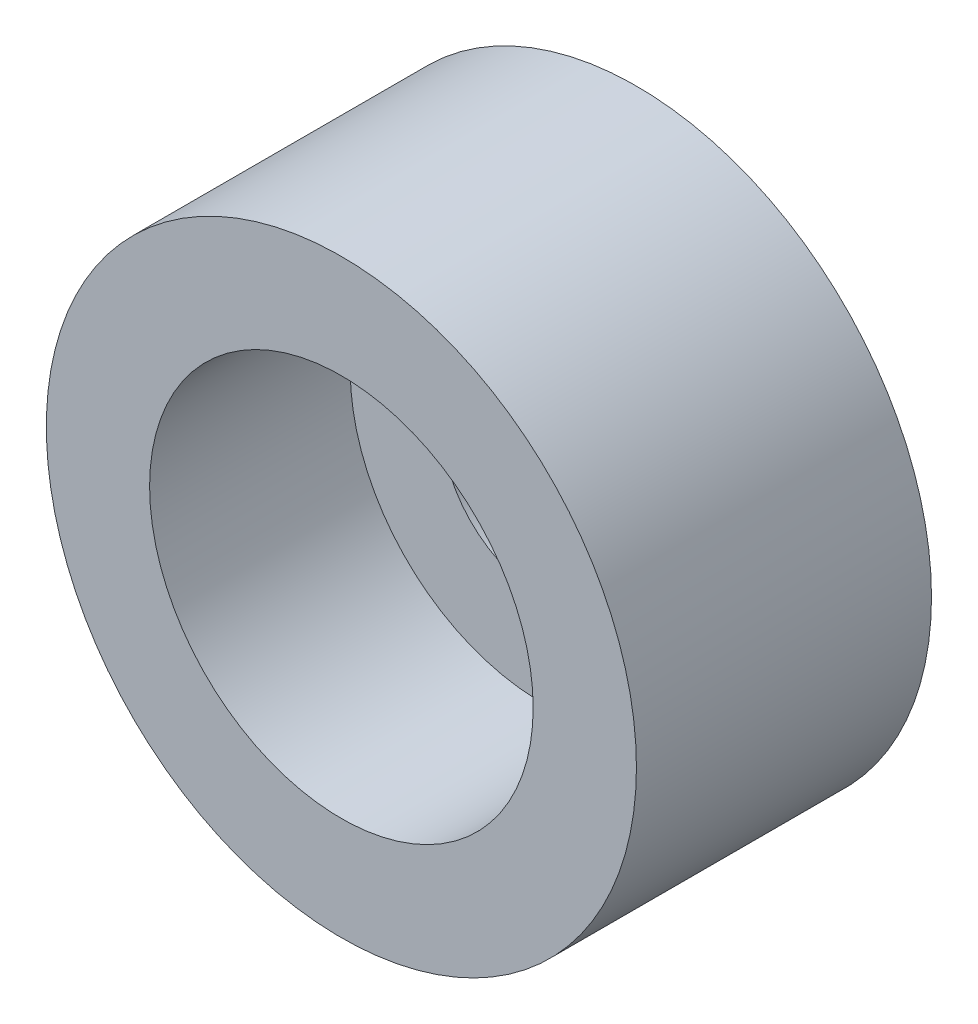
ISO-10303-21;
HEADER;
FILE_DESCRIPTION(('STEP AP214'),'2;1');
FILE_NAME('part.step','',(''),(''),'','','');
FILE_SCHEMA(('AUTOMOTIVE_DESIGN { 1 0 10303 214 1 1 1 1 }'));
ENDSEC;
DATA;
#1=APPLICATION_CONTEXT('core data for automotive mechanical design processes');
#2=APPLICATION_PROTOCOL_DEFINITION('international standard','automotive_design',2000,#1);
#3=PRODUCT_CONTEXT('',#1,'mechanical');
#4=PRODUCT('Part','Part','',(#3));
#5=PRODUCT_RELATED_PRODUCT_CATEGORY('part','',(#4));
#6=PRODUCT_DEFINITION_FORMATION('','',#4);
#7=PRODUCT_DEFINITION_CONTEXT('part definition',#1,'design');
#8=PRODUCT_DEFINITION('design','',#6,#7);
#9=PRODUCT_DEFINITION_SHAPE('','',#8);
#10=(LENGTH_UNIT() NAMED_UNIT(*) SI_UNIT(.MILLI.,.METRE.));
#11=(NAMED_UNIT(*) PLANE_ANGLE_UNIT() SI_UNIT($,.RADIAN.));
#12=(NAMED_UNIT(*) SI_UNIT($,.STERADIAN.) SOLID_ANGLE_UNIT());
#13=UNCERTAINTY_MEASURE_WITH_UNIT(LENGTH_MEASURE(1.E-05),#10,'distance_accuracy_value','');
#14=(GEOMETRIC_REPRESENTATION_CONTEXT(3) GLOBAL_UNCERTAINTY_ASSIGNED_CONTEXT((#13)) GLOBAL_UNIT_ASSIGNED_CONTEXT((#10,
#11,#12)) REPRESENTATION_CONTEXT('',''));
#15=CARTESIAN_POINT('',(0.,0.,0.));
#16=DIRECTION('',(0.,0.,1.));
#17=DIRECTION('',(1.,0.,0.));
#18=AXIS2_PLACEMENT_3D('',#15,#16,#17);
#19=CARTESIAN_POINT('',(0.,0.,5.));
#20=DIRECTION('',(0.,0.,-1.));
#21=DIRECTION('',(-1.,0.,0.));
#22=AXIS2_PLACEMENT_3D('',#19,#20,#21);
#23=CYLINDRICAL_SURFACE('',#22,5.);
#24=CARTESIAN_POINT('',(0.,0.,5.));
#25=DIRECTION('',(0.,0.,1.));
#26=DIRECTION('',(1.,0.,0.));
#27=AXIS2_PLACEMENT_3D('',#24,#25,#26);
#28=CIRCLE('',#27,5.);
#29=CARTESIAN_POINT('',(5.,0.,5.));
#30=VERTEX_POINT('',#29);
#31=EDGE_CURVE('E10',#30,#30,#28,.T.);
#32=ORIENTED_EDGE('',*,*,#31,.F.);
#33=EDGE_LOOP('',(#32));
#34=FACE_BOUND('',#33,.T.);
#35=CARTESIAN_POINT('',(0.,0.,0.));
#36=DIRECTION('',(0.,0.,1.));
#37=DIRECTION('',(1.,0.,0.));
#38=AXIS2_PLACEMENT_3D('',#35,#36,#37);
#39=CIRCLE('',#38,5.);
#40=CARTESIAN_POINT('',(5.,0.,0.));
#41=VERTEX_POINT('',#40);
#42=EDGE_CURVE('E34',#41,#41,#39,.T.);
#43=ORIENTED_EDGE('',*,*,#42,.T.);
#44=EDGE_LOOP('',(#43));
#45=FACE_BOUND('',#44,.T.);
#46=ADVANCED_FACE('F31',(#34,#45),#23,.T.);
#47=CARTESIAN_POINT('',(0.,0.,5.));
#48=DIRECTION('',(0.,0.,1.));
#49=DIRECTION('',(1.,0.,0.));
#50=AXIS2_PLACEMENT_3D('',#47,#48,#49);
#51=PLANE('',#50);
#52=CARTESIAN_POINT('',(0.,0.,5.));
#53=DIRECTION('',(0.,0.,1.));
#54=DIRECTION('',(1.,0.,0.));
#55=AXIS2_PLACEMENT_3D('',#52,#53,#54);
#56=CIRCLE('',#55,3.25);
#57=CARTESIAN_POINT('',(3.25,0.,5.));
#58=VERTEX_POINT('',#57);
#59=EDGE_CURVE('E51',#58,#58,#56,.T.);
#60=ORIENTED_EDGE('',*,*,#59,.F.);
#61=EDGE_LOOP('',(#60));
#62=FACE_BOUND('',#61,.T.);
#63=ORIENTED_EDGE('',*,*,#31,.T.);
#64=EDGE_LOOP('',(#63));
#65=FACE_BOUND('',#64,.T.);
#66=ADVANCED_FACE('F57',(#62,#65),#51,.T.);
#67=CARTESIAN_POINT('',(0.,0.,0.));
#68=DIRECTION('',(0.,0.,1.));
#69=DIRECTION('',(1.,0.,0.));
#70=AXIS2_PLACEMENT_3D('',#67,#68,#69);
#71=PLANE('',#70);
#72=CARTESIAN_POINT('',(0.,0.,0.));
#73=DIRECTION('',(0.,0.,1.));
#74=DIRECTION('',(1.,0.,0.));
#75=AXIS2_PLACEMENT_3D('',#72,#73,#74);
#76=CIRCLE('',#75,1.7);
#77=CARTESIAN_POINT('',(1.7,0.,0.));
#78=VERTEX_POINT('',#77);
#79=EDGE_CURVE('E41',#78,#78,#76,.T.);
#80=ORIENTED_EDGE('',*,*,#79,.T.);
#81=EDGE_LOOP('',(#80));
#82=FACE_BOUND('',#81,.T.);
#83=ORIENTED_EDGE('',*,*,#42,.F.);
#84=EDGE_LOOP('',(#83));
#85=FACE_BOUND('',#84,.T.);
#86=ADVANCED_FACE('F59',(#82,#85),#71,.F.);
#87=CARTESIAN_POINT('',(0.,0.,5.));
#88=DIRECTION('',(0.,0.,1.));
#89=DIRECTION('',(1.,0.,0.));
#90=AXIS2_PLACEMENT_3D('',#87,#88,#89);
#91=CYLINDRICAL_SURFACE('',#90,1.7);
#92=ORIENTED_EDGE('',*,*,#79,.F.);
#93=EDGE_LOOP('',(#92));
#94=FACE_BOUND('',#93,.T.);
#95=CARTESIAN_POINT('',(0.,0.,1.6));
#96=DIRECTION('',(0.,0.,1.));
#97=DIRECTION('',(1.,0.,0.));
#98=AXIS2_PLACEMENT_3D('',#95,#96,#97);
#99=CIRCLE('',#98,1.7);
#100=CARTESIAN_POINT('',(1.7,0.,1.6));
#101=VERTEX_POINT('',#100);
#102=EDGE_CURVE('E45',#101,#101,#99,.T.);
#103=ORIENTED_EDGE('',*,*,#102,.T.);
#104=EDGE_LOOP('',(#103));
#105=FACE_BOUND('',#104,.T.);
#106=ADVANCED_FACE('F65',(#94,#105),#91,.F.);
#107=CARTESIAN_POINT('',(1.7,0.,1.6));
#108=DIRECTION('',(0.,0.,-1.));
#109=DIRECTION('',(-1.,0.,0.));
#110=AXIS2_PLACEMENT_3D('',#107,#108,#109);
#111=PLANE('',#110);
#112=ORIENTED_EDGE('',*,*,#102,.F.);
#113=EDGE_LOOP('',(#112));
#114=FACE_BOUND('',#113,.T.);
#115=CARTESIAN_POINT('',(0.,0.,1.6));
#116=DIRECTION('',(0.,0.,1.));
#117=DIRECTION('',(1.,0.,0.));
#118=AXIS2_PLACEMENT_3D('',#115,#116,#117);
#119=CIRCLE('',#118,3.25);
#120=CARTESIAN_POINT('',(3.25,0.,1.6));
#121=VERTEX_POINT('',#120);
#122=EDGE_CURVE('E48',#121,#121,#119,.T.);
#123=ORIENTED_EDGE('',*,*,#122,.T.);
#124=EDGE_LOOP('',(#123));
#125=FACE_BOUND('',#124,.T.);
#126=ADVANCED_FACE('F71',(#114,#125),#111,.F.);
#127=CARTESIAN_POINT('',(0.,0.,5.));
#128=DIRECTION('',(0.,0.,1.));
#129=DIRECTION('',(1.,0.,0.));
#130=AXIS2_PLACEMENT_3D('',#127,#128,#129);
#131=CYLINDRICAL_SURFACE('',#130,3.25);
#132=ORIENTED_EDGE('',*,*,#122,.F.);
#133=EDGE_LOOP('',(#132));
#134=FACE_BOUND('',#133,.T.);
#135=ORIENTED_EDGE('',*,*,#59,.T.);
#136=EDGE_LOOP('',(#135));
#137=FACE_BOUND('',#136,.T.);
#138=ADVANCED_FACE('F55',(#134,#137),#131,.F.);
#139=CLOSED_SHELL('',(#46,#66,#86,#106,#126,#138));
#140=MANIFOLD_SOLID_BREP('B2',#139);
#141=ADVANCED_BREP_SHAPE_REPRESENTATION('',(#18,#140),#14);
#142=SHAPE_DEFINITION_REPRESENTATION(#9,#141);
ENDSEC;
END-ISO-10303-21;
